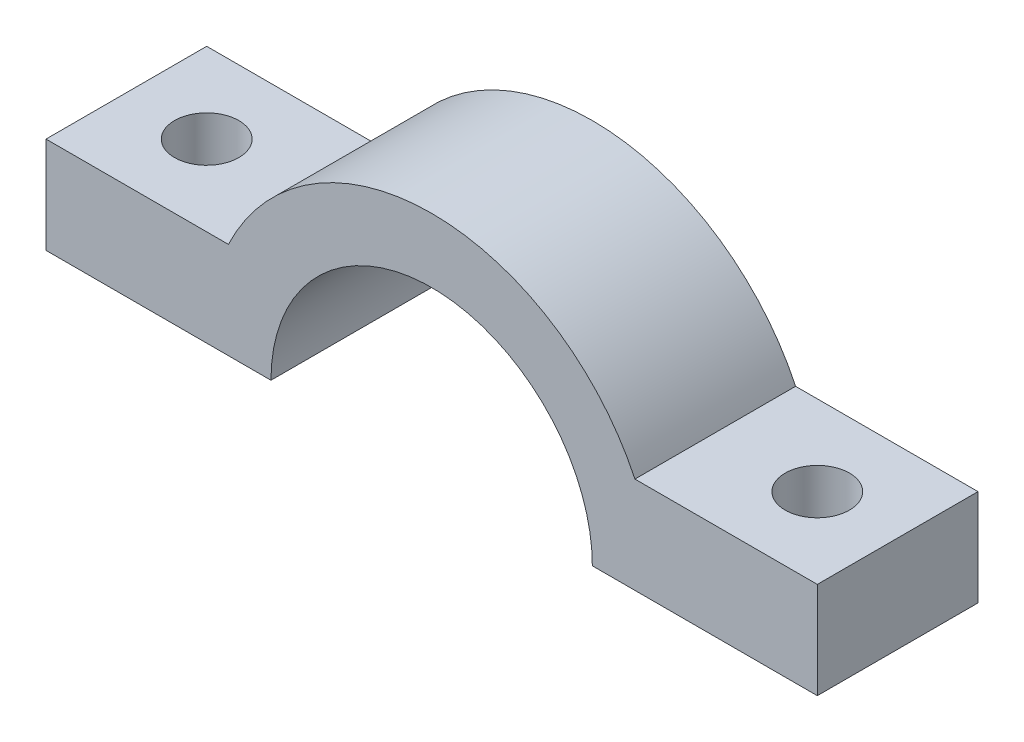
ISO-10303-21;
HEADER;
FILE_DESCRIPTION(('STEP AP214'),'2;1');
FILE_NAME('part.step','',(''),(''),'','','');
FILE_SCHEMA(('AUTOMOTIVE_DESIGN { 1 0 10303 214 1 1 1 1 }'));
ENDSEC;
DATA;
#1=APPLICATION_CONTEXT('core data for automotive mechanical design processes');
#2=APPLICATION_PROTOCOL_DEFINITION('international standard','automotive_design',2000,#1);
#3=PRODUCT_CONTEXT('',#1,'mechanical');
#4=PRODUCT('Part','Part','',(#3));
#5=PRODUCT_RELATED_PRODUCT_CATEGORY('part','',(#4));
#6=PRODUCT_DEFINITION_FORMATION('','',#4);
#7=PRODUCT_DEFINITION_CONTEXT('part definition',#1,'design');
#8=PRODUCT_DEFINITION('design','',#6,#7);
#9=PRODUCT_DEFINITION_SHAPE('','',#8);
#10=(LENGTH_UNIT() NAMED_UNIT(*) SI_UNIT(.MILLI.,.METRE.));
#11=(NAMED_UNIT(*) PLANE_ANGLE_UNIT() SI_UNIT($,.RADIAN.));
#12=(NAMED_UNIT(*) SI_UNIT($,.STERADIAN.) SOLID_ANGLE_UNIT());
#13=UNCERTAINTY_MEASURE_WITH_UNIT(LENGTH_MEASURE(1.E-05),#10,'distance_accuracy_value','');
#14=(GEOMETRIC_REPRESENTATION_CONTEXT(3) GLOBAL_UNCERTAINTY_ASSIGNED_CONTEXT((#13)) GLOBAL_UNIT_ASSIGNED_CONTEXT((#10,
#11,#12)) REPRESENTATION_CONTEXT('',''));
#15=CARTESIAN_POINT('',(0.,0.,0.));
#16=DIRECTION('',(0.,0.,1.));
#17=DIRECTION('',(1.,0.,0.));
#18=AXIS2_PLACEMENT_3D('',#15,#16,#17);
#19=CARTESIAN_POINT('',(0.,0.,5.));
#20=DIRECTION('',(0.,0.,-1.));
#21=DIRECTION('',(-1.,0.,0.));
#22=AXIS2_PLACEMENT_3D('',#19,#20,#21);
#23=CYLINDRICAL_SURFACE('',#22,5.);
#24=CARTESIAN_POINT('',(0.,0.,0.));
#25=DIRECTION('',(0.,0.,-1.));
#26=DIRECTION('',(1.,0.,0.));
#27=AXIS2_PLACEMENT_3D('',#24,#25,#26);
#28=CIRCLE('',#27,5.);
#29=CARTESIAN_POINT('',(-5.,0.,0.));
#30=VERTEX_POINT('',#29);
#31=CARTESIAN_POINT('',(5.,0.,0.));
#32=VERTEX_POINT('',#31);
#33=EDGE_CURVE('E130',#30,#32,#28,.T.);
#34=ORIENTED_EDGE('',*,*,#33,.T.);
#35=DIRECTION('',(0.,0.,-1.));
#36=VECTOR('',#35,1.);
#37=CARTESIAN_POINT('',(5.,0.,5.));
#38=LINE('',#37,#36);
#39=CARTESIAN_POINT('',(5.,0.,5.));
#40=VERTEX_POINT('',#39);
#41=EDGE_CURVE('E11',#40,#32,#38,.T.);
#42=ORIENTED_EDGE('',*,*,#41,.F.);
#43=CARTESIAN_POINT('',(0.,0.,5.));
#44=DIRECTION('',(0.,0.,-1.));
#45=DIRECTION('',(1.,0.,0.));
#46=AXIS2_PLACEMENT_3D('',#43,#44,#45);
#47=CIRCLE('',#46,5.);
#48=CARTESIAN_POINT('',(-5.,0.,5.));
#49=VERTEX_POINT('',#48);
#50=EDGE_CURVE('E146',#49,#40,#47,.T.);
#51=ORIENTED_EDGE('',*,*,#50,.F.);
#52=DIRECTION('',(0.,0.,-1.));
#53=VECTOR('',#52,1.);
#54=CARTESIAN_POINT('',(-5.,0.,5.));
#55=LINE('',#54,#53);
#56=EDGE_CURVE('E126',#49,#30,#55,.T.);
#57=ORIENTED_EDGE('',*,*,#56,.T.);
#58=EDGE_LOOP('',(#34,#42,#51,#57));
#59=FACE_BOUND('',#58,.T.);
#60=ADVANCED_FACE('F32',(#59),#23,.F.);
#61=CARTESIAN_POINT('',(7.,0.,5.));
#62=DIRECTION('',(0.,1.,0.));
#63=DIRECTION('',(-1.,0.,0.));
#64=AXIS2_PLACEMENT_3D('',#61,#62,#63);
#65=PLANE('',#64);
#66=CARTESIAN_POINT('',(9.5,0.,2.5));
#67=DIRECTION('',(0.,1.,0.));
#68=DIRECTION('',(-1.,0.,0.));
#69=AXIS2_PLACEMENT_3D('',#66,#67,#68);
#70=CIRCLE('',#69,1.);
#71=CARTESIAN_POINT('',(8.5,0.,2.5));
#72=VERTEX_POINT('',#71);
#73=EDGE_CURVE('E134',#72,#72,#70,.T.);
#74=ORIENTED_EDGE('',*,*,#73,.T.);
#75=EDGE_LOOP('',(#74));
#76=FACE_BOUND('',#75,.T.);
#77=DIRECTION('',(1.,0.,0.));
#78=VECTOR('',#77,1.);
#79=CARTESIAN_POINT('',(7.,0.,0.));
#80=LINE('',#79,#78);
#81=CARTESIAN_POINT('',(12.,0.,0.));
#82=VERTEX_POINT('',#81);
#83=EDGE_CURVE('E133',#32,#82,#80,.T.);
#84=ORIENTED_EDGE('',*,*,#83,.T.);
#85=DIRECTION('',(0.,0.,-1.));
#86=VECTOR('',#85,1.);
#87=CARTESIAN_POINT('',(12.,0.,5.));
#88=LINE('',#87,#86);
#89=CARTESIAN_POINT('',(12.,0.,5.));
#90=VERTEX_POINT('',#89);
#91=EDGE_CURVE('E41',#90,#82,#88,.T.);
#92=ORIENTED_EDGE('',*,*,#91,.F.);
#93=DIRECTION('',(1.,0.,0.));
#94=VECTOR('',#93,1.);
#95=CARTESIAN_POINT('',(5.,0.,5.));
#96=LINE('',#95,#94);
#97=EDGE_CURVE('E90',#40,#90,#96,.T.);
#98=ORIENTED_EDGE('',*,*,#97,.F.);
#99=ORIENTED_EDGE('',*,*,#41,.T.);
#100=EDGE_LOOP('',(#84,#92,#98,#99));
#101=FACE_BOUND('',#100,.T.);
#102=ADVANCED_FACE('F204',(#76,#101),#65,.F.);
#103=CARTESIAN_POINT('',(12.,0.,5.));
#104=DIRECTION('',(-1.,0.,0.));
#105=DIRECTION('',(0.,0.,1.));
#106=AXIS2_PLACEMENT_3D('',#103,#104,#105);
#107=PLANE('',#106);
#108=DIRECTION('',(0.,1.,0.));
#109=VECTOR('',#108,1.);
#110=CARTESIAN_POINT('',(12.,0.,0.));
#111=LINE('',#110,#109);
#112=CARTESIAN_POINT('',(12.,3.,0.));
#113=VERTEX_POINT('',#112);
#114=EDGE_CURVE('E136',#82,#113,#111,.T.);
#115=ORIENTED_EDGE('',*,*,#114,.T.);
#116=DIRECTION('',(0.,0.,-1.));
#117=VECTOR('',#116,1.);
#118=CARTESIAN_POINT('',(12.,3.,5.));
#119=LINE('',#118,#117);
#120=CARTESIAN_POINT('',(12.,3.,5.));
#121=VERTEX_POINT('',#120);
#122=EDGE_CURVE('E153',#121,#113,#119,.T.);
#123=ORIENTED_EDGE('',*,*,#122,.F.);
#124=DIRECTION('',(0.,1.,0.));
#125=VECTOR('',#124,1.);
#126=CARTESIAN_POINT('',(12.,0.,5.));
#127=LINE('',#126,#125);
#128=EDGE_CURVE('E162',#90,#121,#127,.T.);
#129=ORIENTED_EDGE('',*,*,#128,.F.);
#130=ORIENTED_EDGE('',*,*,#91,.T.);
#131=EDGE_LOOP('',(#115,#123,#129,#130));
#132=FACE_BOUND('',#131,.T.);
#133=ADVANCED_FACE('F160',(#132),#107,.F.);
#134=CARTESIAN_POINT('',(12.,3.,5.));
#135=DIRECTION('',(0.,-1.,0.));
#136=DIRECTION('',(0.,0.,-1.));
#137=AXIS2_PLACEMENT_3D('',#134,#135,#136);
#138=PLANE('',#137);
#139=CARTESIAN_POINT('',(9.5,3.,2.5));
#140=DIRECTION('',(0.,1.,0.));
#141=DIRECTION('',(0.,0.,-1.));
#142=AXIS2_PLACEMENT_3D('',#139,#140,#141);
#143=CIRCLE('',#142,1.);
#144=CARTESIAN_POINT('',(9.5,3.,1.5));
#145=VERTEX_POINT('',#144);
#146=EDGE_CURVE('E180',#145,#145,#143,.T.);
#147=ORIENTED_EDGE('',*,*,#146,.F.);
#148=EDGE_LOOP('',(#147));
#149=FACE_BOUND('',#148,.T.);
#150=DIRECTION('',(-1.,0.,0.));
#151=VECTOR('',#150,1.);
#152=CARTESIAN_POINT('',(12.,3.,0.));
#153=LINE('',#152,#151);
#154=CARTESIAN_POINT('',(6.32455532033676,3.,0.));
#155=VERTEX_POINT('',#154);
#156=EDGE_CURVE('E138',#113,#155,#153,.T.);
#157=ORIENTED_EDGE('',*,*,#156,.T.);
#158=DIRECTION('',(0.,0.,-1.));
#159=VECTOR('',#158,1.);
#160=CARTESIAN_POINT('',(6.32455532033676,3.,5.));
#161=LINE('',#160,#159);
#162=CARTESIAN_POINT('',(6.32455532033676,3.,5.));
#163=VERTEX_POINT('',#162);
#164=EDGE_CURVE('E150',#163,#155,#161,.T.);
#165=ORIENTED_EDGE('',*,*,#164,.F.);
#166=DIRECTION('',(-1.,0.,0.));
#167=VECTOR('',#166,1.);
#168=CARTESIAN_POINT('',(12.,3.,5.));
#169=LINE('',#168,#167);
#170=EDGE_CURVE('E172',#121,#163,#169,.T.);
#171=ORIENTED_EDGE('',*,*,#170,.F.);
#172=ORIENTED_EDGE('',*,*,#122,.T.);
#173=EDGE_LOOP('',(#157,#165,#171,#172));
#174=FACE_BOUND('',#173,.T.);
#175=ADVANCED_FACE('F168',(#149,#174),#138,.F.);
#176=CARTESIAN_POINT('',(0.,0.,5.));
#177=DIRECTION('',(0.,0.,-1.));
#178=DIRECTION('',(-1.,0.,0.));
#179=AXIS2_PLACEMENT_3D('',#176,#177,#178);
#180=CYLINDRICAL_SURFACE('',#179,7.);
#181=CARTESIAN_POINT('',(0.,0.,0.));
#182=DIRECTION('',(0.,0.,1.));
#183=DIRECTION('',(1.,0.,0.));
#184=AXIS2_PLACEMENT_3D('',#181,#182,#183);
#185=CIRCLE('',#184,7.);
#186=CARTESIAN_POINT('',(-6.32455532033676,3.,0.));
#187=VERTEX_POINT('',#186);
#188=EDGE_CURVE('E140',#155,#187,#185,.T.);
#189=ORIENTED_EDGE('',*,*,#188,.T.);
#190=DIRECTION('',(0.,0.,-1.));
#191=VECTOR('',#190,1.);
#192=CARTESIAN_POINT('',(-6.32455532033676,3.,5.));
#193=LINE('',#192,#191);
#194=CARTESIAN_POINT('',(-6.32455532033676,3.,5.));
#195=VERTEX_POINT('',#194);
#196=EDGE_CURVE('E121',#195,#187,#193,.T.);
#197=ORIENTED_EDGE('',*,*,#196,.F.);
#198=CARTESIAN_POINT('',(0.,0.,5.));
#199=DIRECTION('',(0.,0.,1.));
#200=DIRECTION('',(1.,0.,0.));
#201=AXIS2_PLACEMENT_3D('',#198,#199,#200);
#202=CIRCLE('',#201,7.);
#203=EDGE_CURVE('E110',#163,#195,#202,.T.);
#204=ORIENTED_EDGE('',*,*,#203,.F.);
#205=ORIENTED_EDGE('',*,*,#164,.T.);
#206=EDGE_LOOP('',(#189,#197,#204,#205));
#207=FACE_BOUND('',#206,.T.);
#208=ADVANCED_FACE('F171',(#207),#180,.T.);
#209=CARTESIAN_POINT('',(-12.,3.,5.));
#210=DIRECTION('',(0.,-1.,0.));
#211=DIRECTION('',(0.,0.,-1.));
#212=AXIS2_PLACEMENT_3D('',#209,#210,#211);
#213=PLANE('',#212);
#214=CARTESIAN_POINT('',(-9.5,3.,2.5));
#215=DIRECTION('',(0.,1.,0.));
#216=DIRECTION('',(0.,0.,1.));
#217=AXIS2_PLACEMENT_3D('',#214,#215,#216);
#218=CIRCLE('',#217,1.);
#219=CARTESIAN_POINT('',(-9.5,3.,3.5));
#220=VERTEX_POINT('',#219);
#221=EDGE_CURVE('E183',#220,#220,#218,.T.);
#222=ORIENTED_EDGE('',*,*,#221,.F.);
#223=EDGE_LOOP('',(#222));
#224=FACE_BOUND('',#223,.T.);
#225=DIRECTION('',(-1.,0.,0.));
#226=VECTOR('',#225,1.);
#227=CARTESIAN_POINT('',(-12.,3.,0.));
#228=LINE('',#227,#226);
#229=CARTESIAN_POINT('',(-12.,3.,0.));
#230=VERTEX_POINT('',#229);
#231=EDGE_CURVE('E119',#187,#230,#228,.T.);
#232=ORIENTED_EDGE('',*,*,#231,.T.);
#233=DIRECTION('',(0.,0.,-1.));
#234=VECTOR('',#233,1.);
#235=CARTESIAN_POINT('',(-12.,3.,5.));
#236=LINE('',#235,#234);
#237=CARTESIAN_POINT('',(-12.,3.,5.));
#238=VERTEX_POINT('',#237);
#239=EDGE_CURVE('E116',#238,#230,#236,.T.);
#240=ORIENTED_EDGE('',*,*,#239,.F.);
#241=DIRECTION('',(-1.,0.,0.));
#242=VECTOR('',#241,1.);
#243=CARTESIAN_POINT('',(-12.,3.,5.));
#244=LINE('',#243,#242);
#245=EDGE_CURVE('E103',#195,#238,#244,.T.);
#246=ORIENTED_EDGE('',*,*,#245,.F.);
#247=ORIENTED_EDGE('',*,*,#196,.T.);
#248=EDGE_LOOP('',(#232,#240,#246,#247));
#249=FACE_BOUND('',#248,.T.);
#250=ADVANCED_FACE('F117',(#224,#249),#213,.F.);
#251=CARTESIAN_POINT('',(-12.,0.,5.));
#252=DIRECTION('',(1.,0.,0.));
#253=DIRECTION('',(0.,0.,-1.));
#254=AXIS2_PLACEMENT_3D('',#251,#252,#253);
#255=PLANE('',#254);
#256=DIRECTION('',(0.,-1.,0.));
#257=VECTOR('',#256,1.);
#258=CARTESIAN_POINT('',(-12.,0.,0.));
#259=LINE('',#258,#257);
#260=CARTESIAN_POINT('',(-12.,0.,0.));
#261=VERTEX_POINT('',#260);
#262=EDGE_CURVE('E143',#230,#261,#259,.T.);
#263=ORIENTED_EDGE('',*,*,#262,.T.);
#264=DIRECTION('',(0.,0.,-1.));
#265=VECTOR('',#264,1.);
#266=CARTESIAN_POINT('',(-12.,0.,5.));
#267=LINE('',#266,#265);
#268=CARTESIAN_POINT('',(-12.,0.,5.));
#269=VERTEX_POINT('',#268);
#270=EDGE_CURVE('E122',#269,#261,#267,.T.);
#271=ORIENTED_EDGE('',*,*,#270,.F.);
#272=DIRECTION('',(0.,-1.,0.));
#273=VECTOR('',#272,1.);
#274=CARTESIAN_POINT('',(-12.,0.,5.));
#275=LINE('',#274,#273);
#276=EDGE_CURVE('E107',#238,#269,#275,.T.);
#277=ORIENTED_EDGE('',*,*,#276,.F.);
#278=ORIENTED_EDGE('',*,*,#239,.T.);
#279=EDGE_LOOP('',(#263,#271,#277,#278));
#280=FACE_BOUND('',#279,.T.);
#281=ADVANCED_FACE('F124',(#280),#255,.F.);
#282=CARTESIAN_POINT('',(-7.,0.,5.));
#283=DIRECTION('',(0.,1.,0.));
#284=DIRECTION('',(0.,0.,1.));
#285=AXIS2_PLACEMENT_3D('',#282,#283,#284);
#286=PLANE('',#285);
#287=CARTESIAN_POINT('',(-9.5,0.,2.5));
#288=DIRECTION('',(0.,1.,0.));
#289=DIRECTION('',(0.,0.,1.));
#290=AXIS2_PLACEMENT_3D('',#287,#288,#289);
#291=CIRCLE('',#290,1.);
#292=CARTESIAN_POINT('',(-9.5,0.,3.5));
#293=VERTEX_POINT('',#292);
#294=EDGE_CURVE('E35',#293,#293,#291,.T.);
#295=ORIENTED_EDGE('',*,*,#294,.T.);
#296=EDGE_LOOP('',(#295));
#297=FACE_BOUND('',#296,.T.);
#298=DIRECTION('',(1.,0.,0.));
#299=VECTOR('',#298,1.);
#300=CARTESIAN_POINT('',(-7.,0.,0.));
#301=LINE('',#300,#299);
#302=EDGE_CURVE('E78',#261,#30,#301,.T.);
#303=ORIENTED_EDGE('',*,*,#302,.T.);
#304=ORIENTED_EDGE('',*,*,#56,.F.);
#305=DIRECTION('',(1.,0.,0.));
#306=VECTOR('',#305,1.);
#307=CARTESIAN_POINT('',(-7.,0.,5.));
#308=LINE('',#307,#306);
#309=EDGE_CURVE('E49',#269,#49,#308,.T.);
#310=ORIENTED_EDGE('',*,*,#309,.F.);
#311=ORIENTED_EDGE('',*,*,#270,.T.);
#312=EDGE_LOOP('',(#303,#304,#310,#311));
#313=FACE_BOUND('',#312,.T.);
#314=ADVANCED_FACE('F190',(#297,#313),#286,.F.);
#315=CARTESIAN_POINT('',(0.,0.,5.));
#316=DIRECTION('',(0.,0.,1.));
#317=DIRECTION('',(1.,0.,0.));
#318=AXIS2_PLACEMENT_3D('',#315,#316,#317);
#319=PLANE('',#318);
#320=ORIENTED_EDGE('',*,*,#50,.T.);
#321=ORIENTED_EDGE('',*,*,#97,.T.);
#322=ORIENTED_EDGE('',*,*,#128,.T.);
#323=ORIENTED_EDGE('',*,*,#170,.T.);
#324=ORIENTED_EDGE('',*,*,#203,.T.);
#325=ORIENTED_EDGE('',*,*,#245,.T.);
#326=ORIENTED_EDGE('',*,*,#276,.T.);
#327=ORIENTED_EDGE('',*,*,#309,.T.);
#328=EDGE_LOOP('',(#320,#321,#322,#323,#324,#325,#326,#327));
#329=FACE_BOUND('',#328,.T.);
#330=ADVANCED_FACE('F105',(#329),#319,.T.);
#331=CARTESIAN_POINT('',(0.,0.,0.));
#332=DIRECTION('',(0.,0.,1.));
#333=DIRECTION('',(1.,0.,0.));
#334=AXIS2_PLACEMENT_3D('',#331,#332,#333);
#335=PLANE('',#334);
#336=ORIENTED_EDGE('',*,*,#33,.F.);
#337=ORIENTED_EDGE('',*,*,#302,.F.);
#338=ORIENTED_EDGE('',*,*,#262,.F.);
#339=ORIENTED_EDGE('',*,*,#231,.F.);
#340=ORIENTED_EDGE('',*,*,#188,.F.);
#341=ORIENTED_EDGE('',*,*,#156,.F.);
#342=ORIENTED_EDGE('',*,*,#114,.F.);
#343=ORIENTED_EDGE('',*,*,#83,.F.);
#344=EDGE_LOOP('',(#336,#337,#338,#339,#340,#341,#342,#343));
#345=FACE_BOUND('',#344,.T.);
#346=ADVANCED_FACE('F164',(#345),#335,.F.);
#347=CARTESIAN_POINT('',(-9.5,-2.,2.5));
#348=DIRECTION('',(0.,1.,0.));
#349=DIRECTION('',(0.,0.,1.));
#350=AXIS2_PLACEMENT_3D('',#347,#348,#349);
#351=CYLINDRICAL_SURFACE('',#350,1.);
#352=ORIENTED_EDGE('',*,*,#221,.T.);
#353=EDGE_LOOP('',(#352));
#354=FACE_BOUND('',#353,.T.);
#355=ORIENTED_EDGE('',*,*,#294,.F.);
#356=EDGE_LOOP('',(#355));
#357=FACE_BOUND('',#356,.T.);
#358=ADVANCED_FACE('F192',(#354,#357),#351,.F.);
#359=CARTESIAN_POINT('',(9.5,-2.,2.5));
#360=DIRECTION('',(0.,1.,0.));
#361=DIRECTION('',(0.,0.,1.));
#362=AXIS2_PLACEMENT_3D('',#359,#360,#361);
#363=CYLINDRICAL_SURFACE('',#362,1.);
#364=ORIENTED_EDGE('',*,*,#146,.T.);
#365=EDGE_LOOP('',(#364));
#366=FACE_BOUND('',#365,.T.);
#367=ORIENTED_EDGE('',*,*,#73,.F.);
#368=EDGE_LOOP('',(#367));
#369=FACE_BOUND('',#368,.T.);
#370=ADVANCED_FACE('F194',(#366,#369),#363,.F.);
#371=CLOSED_SHELL('',(#60,#102,#133,#175,#208,#250,#281,#314,#330,#346,#358,#370));
#372=MANIFOLD_SOLID_BREP('B2',#371);
#373=ADVANCED_BREP_SHAPE_REPRESENTATION('',(#18,#372),#14);
#374=SHAPE_DEFINITION_REPRESENTATION(#9,#373);
ENDSEC;
END-ISO-10303-21;
